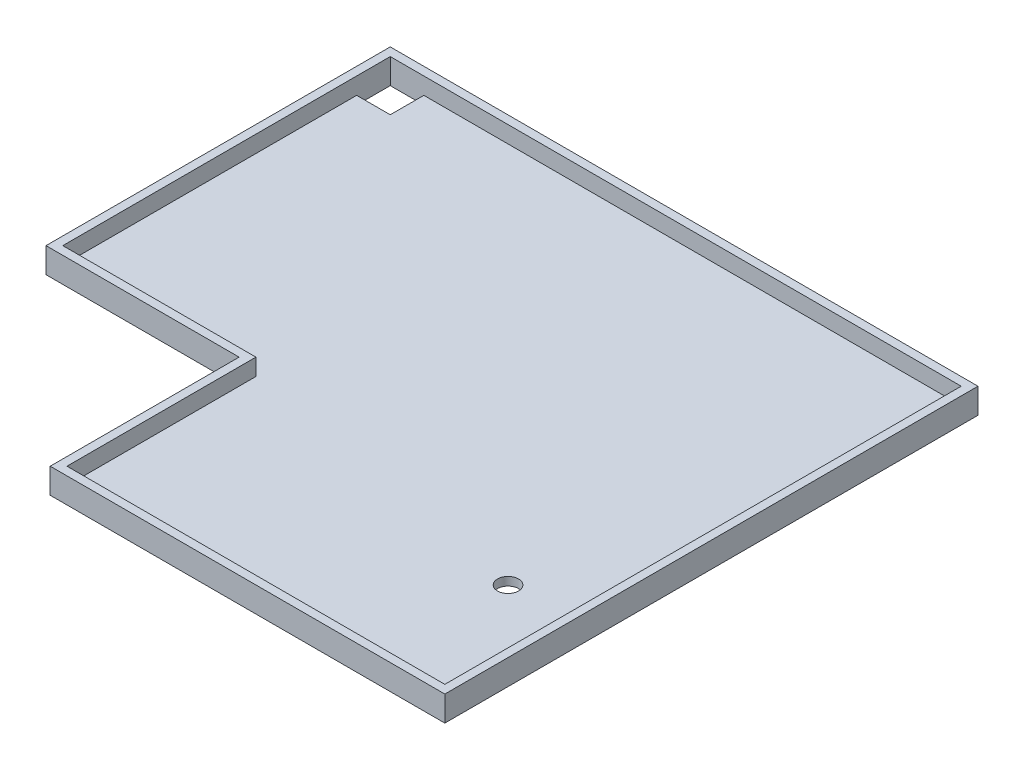
ISO-10303-21;
HEADER;
FILE_DESCRIPTION(('STEP AP214'),'2;1');
FILE_NAME('part.step','',(''),(''),'','','');
FILE_SCHEMA(('AUTOMOTIVE_DESIGN { 1 0 10303 214 1 1 1 1 }'));
ENDSEC;
DATA;
#1=APPLICATION_CONTEXT('core data for automotive mechanical design processes');
#2=APPLICATION_PROTOCOL_DEFINITION('international standard','automotive_design',2000,#1);
#3=PRODUCT_CONTEXT('',#1,'mechanical');
#4=PRODUCT('Part','Part','',(#3));
#5=PRODUCT_RELATED_PRODUCT_CATEGORY('part','',(#4));
#6=PRODUCT_DEFINITION_FORMATION('','',#4);
#7=PRODUCT_DEFINITION_CONTEXT('part definition',#1,'design');
#8=PRODUCT_DEFINITION('design','',#6,#7);
#9=PRODUCT_DEFINITION_SHAPE('','',#8);
#10=(LENGTH_UNIT() NAMED_UNIT(*) SI_UNIT(.MILLI.,.METRE.));
#11=(NAMED_UNIT(*) PLANE_ANGLE_UNIT() SI_UNIT($,.RADIAN.));
#12=(NAMED_UNIT(*) SI_UNIT($,.STERADIAN.) SOLID_ANGLE_UNIT());
#13=UNCERTAINTY_MEASURE_WITH_UNIT(LENGTH_MEASURE(1.E-05),#10,'distance_accuracy_value','');
#14=(GEOMETRIC_REPRESENTATION_CONTEXT(3) GLOBAL_UNCERTAINTY_ASSIGNED_CONTEXT((#13)) GLOBAL_UNIT_ASSIGNED_CONTEXT((#10,
#11,#12)) REPRESENTATION_CONTEXT('',''));
#15=CARTESIAN_POINT('',(0.,0.,0.));
#16=DIRECTION('',(0.,0.,1.));
#17=DIRECTION('',(1.,0.,0.));
#18=AXIS2_PLACEMENT_3D('',#15,#16,#17);
#19=CARTESIAN_POINT('',(35.,3.,0.));
#20=DIRECTION('',(1.,0.,0.));
#21=DIRECTION('',(0.,0.,-1.));
#22=AXIS2_PLACEMENT_3D('',#19,#20,#21);
#23=PLANE('',#22);
#24=DIRECTION('',(0.,0.,1.));
#25=VECTOR('',#24,1.);
#26=CARTESIAN_POINT('',(35.,0.,0.));
#27=LINE('',#26,#25);
#28=CARTESIAN_POINT('',(35.,0.,-20.));
#29=VERTEX_POINT('',#28);
#30=CARTESIAN_POINT('',(35.,0.,43.5));
#31=VERTEX_POINT('',#30);
#32=EDGE_CURVE('E225',#29,#31,#27,.T.);
#33=ORIENTED_EDGE('',*,*,#32,.F.);
#34=DIRECTION('',(0.,-1.,0.));
#35=VECTOR('',#34,1.);
#36=CARTESIAN_POINT('',(35.,3.,-20.));
#37=LINE('',#36,#35);
#38=CARTESIAN_POINT('',(35.,3.,-20.));
#39=VERTEX_POINT('',#38);
#40=EDGE_CURVE('E11',#39,#29,#37,.T.);
#41=ORIENTED_EDGE('',*,*,#40,.F.);
#42=DIRECTION('',(0.,0.,1.));
#43=VECTOR('',#42,1.);
#44=CARTESIAN_POINT('',(35.,3.,0.));
#45=LINE('',#44,#43);
#46=CARTESIAN_POINT('',(35.,3.,43.5));
#47=VERTEX_POINT('',#46);
#48=EDGE_CURVE('E226',#39,#47,#45,.T.);
#49=ORIENTED_EDGE('',*,*,#48,.T.);
#50=DIRECTION('',(0.,-1.,0.));
#51=VECTOR('',#50,1.);
#52=CARTESIAN_POINT('',(35.,3.,43.5));
#53=LINE('',#52,#51);
#54=EDGE_CURVE('E244',#47,#31,#53,.T.);
#55=ORIENTED_EDGE('',*,*,#54,.T.);
#56=EDGE_LOOP('',(#33,#41,#49,#55));
#57=FACE_BOUND('',#56,.T.);
#58=ADVANCED_FACE('F39',(#57),#23,.T.);
#59=CARTESIAN_POINT('',(0.,3.,-20.));
#60=DIRECTION('',(0.,0.,-1.));
#61=DIRECTION('',(-1.,0.,0.));
#62=AXIS2_PLACEMENT_3D('',#59,#60,#61);
#63=PLANE('',#62);
#64=DIRECTION('',(1.,0.,0.));
#65=VECTOR('',#64,1.);
#66=CARTESIAN_POINT('',(0.,0.,-20.));
#67=LINE('',#66,#65);
#68=CARTESIAN_POINT('',(-35.,0.,-20.));
#69=VERTEX_POINT('',#68);
#70=EDGE_CURVE('E247',#69,#29,#67,.T.);
#71=ORIENTED_EDGE('',*,*,#70,.F.);
#72=DIRECTION('',(0.,-1.,0.));
#73=VECTOR('',#72,1.);
#74=CARTESIAN_POINT('',(-35.,3.,-20.));
#75=LINE('',#74,#73);
#76=CARTESIAN_POINT('',(-35.,3.,-20.));
#77=VERTEX_POINT('',#76);
#78=EDGE_CURVE('E46',#77,#69,#75,.T.);
#79=ORIENTED_EDGE('',*,*,#78,.F.);
#80=DIRECTION('',(1.,0.,0.));
#81=VECTOR('',#80,1.);
#82=CARTESIAN_POINT('',(0.,3.,-20.));
#83=LINE('',#82,#81);
#84=EDGE_CURVE('E229',#77,#39,#83,.T.);
#85=ORIENTED_EDGE('',*,*,#84,.T.);
#86=ORIENTED_EDGE('',*,*,#40,.T.);
#87=EDGE_LOOP('',(#71,#79,#85,#86));
#88=FACE_BOUND('',#87,.T.);
#89=ADVANCED_FACE('F274',(#88),#63,.T.);
#90=CARTESIAN_POINT('',(-35.,3.,0.));
#91=DIRECTION('',(-1.,0.,0.));
#92=DIRECTION('',(0.,0.,1.));
#93=AXIS2_PLACEMENT_3D('',#90,#91,#92);
#94=PLANE('',#93);
#95=DIRECTION('',(0.,0.,-1.));
#96=VECTOR('',#95,1.);
#97=CARTESIAN_POINT('',(-35.,0.,0.));
#98=LINE('',#97,#96);
#99=CARTESIAN_POINT('',(-35.,0.,21.));
#100=VERTEX_POINT('',#99);
#101=EDGE_CURVE('E250',#100,#69,#98,.T.);
#102=ORIENTED_EDGE('',*,*,#101,.F.);
#103=DIRECTION('',(0.,-1.,0.));
#104=VECTOR('',#103,1.);
#105=CARTESIAN_POINT('',(-35.,3.,21.));
#106=LINE('',#105,#104);
#107=CARTESIAN_POINT('',(-35.,3.,21.));
#108=VERTEX_POINT('',#107);
#109=EDGE_CURVE('E266',#108,#100,#106,.T.);
#110=ORIENTED_EDGE('',*,*,#109,.F.);
#111=DIRECTION('',(0.,0.,-1.));
#112=VECTOR('',#111,1.);
#113=CARTESIAN_POINT('',(-35.,3.,0.));
#114=LINE('',#113,#112);
#115=EDGE_CURVE('E233',#108,#77,#114,.T.);
#116=ORIENTED_EDGE('',*,*,#115,.T.);
#117=ORIENTED_EDGE('',*,*,#78,.T.);
#118=EDGE_LOOP('',(#102,#110,#116,#117));
#119=FACE_BOUND('',#118,.T.);
#120=ADVANCED_FACE('F270',(#119),#94,.T.);
#121=CARTESIAN_POINT('',(0.,3.,21.));
#122=DIRECTION('',(0.,0.,1.));
#123=DIRECTION('',(1.,0.,0.));
#124=AXIS2_PLACEMENT_3D('',#121,#122,#123);
#125=PLANE('',#124);
#126=DIRECTION('',(-1.,0.,0.));
#127=VECTOR('',#126,1.);
#128=CARTESIAN_POINT('',(0.,0.,21.));
#129=LINE('',#128,#127);
#130=CARTESIAN_POINT('',(-12.,0.,21.));
#131=VERTEX_POINT('',#130);
#132=EDGE_CURVE('E253',#131,#100,#129,.T.);
#133=ORIENTED_EDGE('',*,*,#132,.F.);
#134=DIRECTION('',(0.,-1.,0.));
#135=VECTOR('',#134,1.);
#136=CARTESIAN_POINT('',(-12.,3.,21.));
#137=LINE('',#136,#135);
#138=CARTESIAN_POINT('',(-12.,3.,21.));
#139=VERTEX_POINT('',#138);
#140=EDGE_CURVE('E264',#139,#131,#137,.T.);
#141=ORIENTED_EDGE('',*,*,#140,.F.);
#142=DIRECTION('',(-1.,0.,0.));
#143=VECTOR('',#142,1.);
#144=CARTESIAN_POINT('',(0.,3.,21.));
#145=LINE('',#144,#143);
#146=EDGE_CURVE('E236',#139,#108,#145,.T.);
#147=ORIENTED_EDGE('',*,*,#146,.T.);
#148=ORIENTED_EDGE('',*,*,#109,.T.);
#149=EDGE_LOOP('',(#133,#141,#147,#148));
#150=FACE_BOUND('',#149,.T.);
#151=ADVANCED_FACE('F281',(#150),#125,.T.);
#152=CARTESIAN_POINT('',(-12.,3.,0.));
#153=DIRECTION('',(-1.,0.,0.));
#154=DIRECTION('',(0.,0.,1.));
#155=AXIS2_PLACEMENT_3D('',#152,#153,#154);
#156=PLANE('',#155);
#157=DIRECTION('',(0.,0.,-1.));
#158=VECTOR('',#157,1.);
#159=CARTESIAN_POINT('',(-12.,0.,0.));
#160=LINE('',#159,#158);
#161=CARTESIAN_POINT('',(-12.,0.,43.5));
#162=VERTEX_POINT('',#161);
#163=EDGE_CURVE('E256',#162,#131,#160,.T.);
#164=ORIENTED_EDGE('',*,*,#163,.F.);
#165=DIRECTION('',(0.,-1.,0.));
#166=VECTOR('',#165,1.);
#167=CARTESIAN_POINT('',(-12.,3.,43.5));
#168=LINE('',#167,#166);
#169=CARTESIAN_POINT('',(-12.,3.,43.5));
#170=VERTEX_POINT('',#169);
#171=EDGE_CURVE('E262',#170,#162,#168,.T.);
#172=ORIENTED_EDGE('',*,*,#171,.F.);
#173=DIRECTION('',(0.,0.,-1.));
#174=VECTOR('',#173,1.);
#175=CARTESIAN_POINT('',(-12.,3.,0.));
#176=LINE('',#175,#174);
#177=EDGE_CURVE('E239',#170,#139,#176,.T.);
#178=ORIENTED_EDGE('',*,*,#177,.T.);
#179=ORIENTED_EDGE('',*,*,#140,.T.);
#180=EDGE_LOOP('',(#164,#172,#178,#179));
#181=FACE_BOUND('',#180,.T.);
#182=ADVANCED_FACE('F292',(#181),#156,.T.);
#183=CARTESIAN_POINT('',(0.,3.,43.5));
#184=DIRECTION('',(0.,0.,-1.));
#185=DIRECTION('',(-1.,0.,0.));
#186=AXIS2_PLACEMENT_3D('',#183,#184,#185);
#187=PLANE('',#186);
#188=DIRECTION('',(1.,0.,0.));
#189=VECTOR('',#188,1.);
#190=CARTESIAN_POINT('',(0.,0.,43.5));
#191=LINE('',#190,#189);
#192=EDGE_CURVE('E230',#162,#31,#191,.T.);
#193=ORIENTED_EDGE('',*,*,#192,.T.);
#194=ORIENTED_EDGE('',*,*,#54,.F.);
#195=DIRECTION('',(1.,0.,0.));
#196=VECTOR('',#195,1.);
#197=CARTESIAN_POINT('',(0.,3.,43.5));
#198=LINE('',#197,#196);
#199=EDGE_CURVE('E242',#170,#47,#198,.T.);
#200=ORIENTED_EDGE('',*,*,#199,.F.);
#201=ORIENTED_EDGE('',*,*,#171,.T.);
#202=EDGE_LOOP('',(#193,#194,#200,#201));
#203=FACE_BOUND('',#202,.T.);
#204=ADVANCED_FACE('F293',(#203),#187,.F.);
#205=CARTESIAN_POINT('',(0.,3.,0.));
#206=DIRECTION('',(0.,1.,0.));
#207=DIRECTION('',(0.,0.,1.));
#208=AXIS2_PLACEMENT_3D('',#205,#206,#207);
#209=PLANE('',#208);
#210=DIRECTION('',(0.,0.,1.));
#211=VECTOR('',#210,1.);
#212=CARTESIAN_POINT('',(34.,3.,0.));
#213=LINE('',#212,#211);
#214=CARTESIAN_POINT('',(34.,3.,-19.));
#215=VERTEX_POINT('',#214);
#216=CARTESIAN_POINT('',(34.,3.,42.5));
#217=VERTEX_POINT('',#216);
#218=EDGE_CURVE('E181',#215,#217,#213,.T.);
#219=ORIENTED_EDGE('',*,*,#218,.T.);
#220=DIRECTION('',(1.,0.,0.));
#221=VECTOR('',#220,1.);
#222=CARTESIAN_POINT('',(0.,3.,42.5));
#223=LINE('',#222,#221);
#224=CARTESIAN_POINT('',(-11.,3.,42.5));
#225=VERTEX_POINT('',#224);
#226=EDGE_CURVE('E197',#225,#217,#223,.T.);
#227=ORIENTED_EDGE('',*,*,#226,.F.);
#228=DIRECTION('',(0.,0.,-1.));
#229=VECTOR('',#228,1.);
#230=CARTESIAN_POINT('',(-11.,3.,0.));
#231=LINE('',#230,#229);
#232=CARTESIAN_POINT('',(-11.,3.,20.));
#233=VERTEX_POINT('',#232);
#234=EDGE_CURVE('E194',#225,#233,#231,.T.);
#235=ORIENTED_EDGE('',*,*,#234,.T.);
#236=DIRECTION('',(-1.,0.,0.));
#237=VECTOR('',#236,1.);
#238=CARTESIAN_POINT('',(0.,3.,20.));
#239=LINE('',#238,#237);
#240=CARTESIAN_POINT('',(-34.,3.,20.));
#241=VERTEX_POINT('',#240);
#242=EDGE_CURVE('E191',#233,#241,#239,.T.);
#243=ORIENTED_EDGE('',*,*,#242,.T.);
#244=DIRECTION('',(0.,0.,-1.));
#245=VECTOR('',#244,1.);
#246=CARTESIAN_POINT('',(-34.,3.,0.));
#247=LINE('',#246,#245);
#248=CARTESIAN_POINT('',(-34.,3.,-19.));
#249=VERTEX_POINT('',#248);
#250=EDGE_CURVE('E188',#241,#249,#247,.T.);
#251=ORIENTED_EDGE('',*,*,#250,.T.);
#252=DIRECTION('',(1.,0.,0.));
#253=VECTOR('',#252,1.);
#254=CARTESIAN_POINT('',(0.,3.,-19.));
#255=LINE('',#254,#253);
#256=EDGE_CURVE('E184',#249,#215,#255,.T.);
#257=ORIENTED_EDGE('',*,*,#256,.T.);
#258=EDGE_LOOP('',(#219,#227,#235,#243,#251,#257));
#259=FACE_BOUND('',#258,.T.);
#260=ORIENTED_EDGE('',*,*,#48,.F.);
#261=ORIENTED_EDGE('',*,*,#84,.F.);
#262=ORIENTED_EDGE('',*,*,#115,.F.);
#263=ORIENTED_EDGE('',*,*,#146,.F.);
#264=ORIENTED_EDGE('',*,*,#177,.F.);
#265=ORIENTED_EDGE('',*,*,#199,.T.);
#266=EDGE_LOOP('',(#260,#261,#262,#263,#264,#265));
#267=FACE_BOUND('',#266,.T.);
#268=ADVANCED_FACE('F285',(#259,#267),#209,.T.);
#269=CARTESIAN_POINT('',(0.,0.,0.));
#270=DIRECTION('',(0.,1.,0.));
#271=DIRECTION('',(0.,0.,1.));
#272=AXIS2_PLACEMENT_3D('',#269,#270,#271);
#273=PLANE('',#272);
#274=DIRECTION('',(1.,0.,0.));
#275=VECTOR('',#274,1.);
#276=CARTESIAN_POINT('',(-34.,0.,-19.));
#277=LINE('',#276,#275);
#278=CARTESIAN_POINT('',(-34.,0.,-19.));
#279=VERTEX_POINT('',#278);
#280=CARTESIAN_POINT('',(-30.,0.,-19.));
#281=VERTEX_POINT('',#280);
#282=EDGE_CURVE('E164',#279,#281,#277,.T.);
#283=ORIENTED_EDGE('',*,*,#282,.F.);
#284=DIRECTION('',(0.,0.,-1.));
#285=VECTOR('',#284,1.);
#286=CARTESIAN_POINT('',(-34.,0.,-19.));
#287=LINE('',#286,#285);
#288=CARTESIAN_POINT('',(-34.,0.,-15.));
#289=VERTEX_POINT('',#288);
#290=EDGE_CURVE('E147',#289,#279,#287,.T.);
#291=ORIENTED_EDGE('',*,*,#290,.F.);
#292=DIRECTION('',(-1.,0.,0.));
#293=VECTOR('',#292,1.);
#294=CARTESIAN_POINT('',(-34.,0.,-15.));
#295=LINE('',#294,#293);
#296=CARTESIAN_POINT('',(-30.,0.,-15.));
#297=VERTEX_POINT('',#296);
#298=EDGE_CURVE('E155',#297,#289,#295,.T.);
#299=ORIENTED_EDGE('',*,*,#298,.F.);
#300=DIRECTION('',(0.,0.,1.));
#301=VECTOR('',#300,1.);
#302=CARTESIAN_POINT('',(-30.,0.,-19.));
#303=LINE('',#302,#301);
#304=EDGE_CURVE('E53',#281,#297,#303,.T.);
#305=ORIENTED_EDGE('',*,*,#304,.F.);
#306=EDGE_LOOP('',(#283,#291,#299,#305));
#307=FACE_BOUND('',#306,.T.);
#308=CARTESIAN_POINT('',(25.5140703453169,0.,26.4861130733692));
#309=DIRECTION('',(0.,1.,0.));
#310=DIRECTION('',(0.,0.,1.));
#311=AXIS2_PLACEMENT_3D('',#308,#309,#310);
#312=CIRCLE('',#311,1.25);
#313=CARTESIAN_POINT('',(25.5140703453169,0.,27.7361130733692));
#314=VERTEX_POINT('',#313);
#315=EDGE_CURVE('E175',#314,#314,#312,.T.);
#316=ORIENTED_EDGE('',*,*,#315,.T.);
#317=EDGE_LOOP('',(#316));
#318=FACE_BOUND('',#317,.T.);
#319=ORIENTED_EDGE('',*,*,#32,.T.);
#320=ORIENTED_EDGE('',*,*,#192,.F.);
#321=ORIENTED_EDGE('',*,*,#163,.T.);
#322=ORIENTED_EDGE('',*,*,#132,.T.);
#323=ORIENTED_EDGE('',*,*,#101,.T.);
#324=ORIENTED_EDGE('',*,*,#70,.T.);
#325=EDGE_LOOP('',(#319,#320,#321,#322,#323,#324));
#326=FACE_BOUND('',#325,.T.);
#327=ADVANCED_FACE('F161',(#307,#318,#326),#273,.F.);
#328=CARTESIAN_POINT('',(34.,3.,0.));
#329=DIRECTION('',(1.,0.,0.));
#330=DIRECTION('',(0.,0.,-1.));
#331=AXIS2_PLACEMENT_3D('',#328,#329,#330);
#332=PLANE('',#331);
#333=DIRECTION('',(0.,0.,1.));
#334=VECTOR('',#333,1.);
#335=CARTESIAN_POINT('',(34.,1.,0.));
#336=LINE('',#335,#334);
#337=CARTESIAN_POINT('',(34.,1.,-19.));
#338=VERTEX_POINT('',#337);
#339=CARTESIAN_POINT('',(34.,1.,42.5));
#340=VERTEX_POINT('',#339);
#341=EDGE_CURVE('E178',#338,#340,#336,.T.);
#342=ORIENTED_EDGE('',*,*,#341,.T.);
#343=DIRECTION('',(0.,-1.,0.));
#344=VECTOR('',#343,1.);
#345=CARTESIAN_POINT('',(34.,3.,42.5));
#346=LINE('',#345,#344);
#347=EDGE_CURVE('E199',#217,#340,#346,.T.);
#348=ORIENTED_EDGE('',*,*,#347,.F.);
#349=ORIENTED_EDGE('',*,*,#218,.F.);
#350=DIRECTION('',(0.,-1.,0.));
#351=VECTOR('',#350,1.);
#352=CARTESIAN_POINT('',(34.,3.,-19.));
#353=LINE('',#352,#351);
#354=EDGE_CURVE('E222',#215,#338,#353,.T.);
#355=ORIENTED_EDGE('',*,*,#354,.T.);
#356=EDGE_LOOP('',(#342,#348,#349,#355));
#357=FACE_BOUND('',#356,.T.);
#358=ADVANCED_FACE('F339',(#357),#332,.F.);
#359=CARTESIAN_POINT('',(0.,3.,-19.));
#360=DIRECTION('',(0.,0.,-1.));
#361=DIRECTION('',(-1.,0.,0.));
#362=AXIS2_PLACEMENT_3D('',#359,#360,#361);
#363=PLANE('',#362);
#364=DIRECTION('',(0.,-1.,0.));
#365=VECTOR('',#364,1.);
#366=CARTESIAN_POINT('',(-34.,3.,-19.));
#367=LINE('',#366,#365);
#368=EDGE_CURVE('E220',#249,#279,#367,.T.);
#369=ORIENTED_EDGE('',*,*,#368,.T.);
#370=ORIENTED_EDGE('',*,*,#282,.T.);
#371=DIRECTION('',(0.,1.,0.));
#372=VECTOR('',#371,1.);
#373=CARTESIAN_POINT('',(-30.,-0.000999999999999916,-19.));
#374=LINE('',#373,#372);
#375=CARTESIAN_POINT('',(-30.,1.,-19.));
#376=VERTEX_POINT('',#375);
#377=EDGE_CURVE('E159',#281,#376,#374,.T.);
#378=ORIENTED_EDGE('',*,*,#377,.T.);
#379=DIRECTION('',(1.,0.,0.));
#380=VECTOR('',#379,1.);
#381=CARTESIAN_POINT('',(0.,1.,-19.));
#382=LINE('',#381,#380);
#383=EDGE_CURVE('E202',#376,#338,#382,.T.);
#384=ORIENTED_EDGE('',*,*,#383,.T.);
#385=ORIENTED_EDGE('',*,*,#354,.F.);
#386=ORIENTED_EDGE('',*,*,#256,.F.);
#387=EDGE_LOOP('',(#369,#370,#378,#384,#385,#386));
#388=FACE_BOUND('',#387,.T.);
#389=ADVANCED_FACE('F344',(#388),#363,.F.);
#390=CARTESIAN_POINT('',(-34.,3.,0.));
#391=DIRECTION('',(-1.,0.,0.));
#392=DIRECTION('',(0.,0.,1.));
#393=AXIS2_PLACEMENT_3D('',#390,#391,#392);
#394=PLANE('',#393);
#395=DIRECTION('',(0.,0.,-1.));
#396=VECTOR('',#395,1.);
#397=CARTESIAN_POINT('',(-34.,1.,0.));
#398=LINE('',#397,#396);
#399=CARTESIAN_POINT('',(-34.,1.,20.));
#400=VERTEX_POINT('',#399);
#401=CARTESIAN_POINT('',(-34.,1.,-15.));
#402=VERTEX_POINT('',#401);
#403=EDGE_CURVE('E150',#400,#402,#398,.T.);
#404=ORIENTED_EDGE('',*,*,#403,.T.);
#405=DIRECTION('',(0.,1.,0.));
#406=VECTOR('',#405,1.);
#407=CARTESIAN_POINT('',(-34.,-0.000999999999999916,-15.));
#408=LINE('',#407,#406);
#409=EDGE_CURVE('E61',#289,#402,#408,.T.);
#410=ORIENTED_EDGE('',*,*,#409,.F.);
#411=ORIENTED_EDGE('',*,*,#290,.T.);
#412=ORIENTED_EDGE('',*,*,#368,.F.);
#413=ORIENTED_EDGE('',*,*,#250,.F.);
#414=DIRECTION('',(0.,-1.,0.));
#415=VECTOR('',#414,1.);
#416=CARTESIAN_POINT('',(-34.,3.,20.));
#417=LINE('',#416,#415);
#418=EDGE_CURVE('E218',#241,#400,#417,.T.);
#419=ORIENTED_EDGE('',*,*,#418,.T.);
#420=EDGE_LOOP('',(#404,#410,#411,#412,#413,#419));
#421=FACE_BOUND('',#420,.T.);
#422=ADVANCED_FACE('F145',(#421),#394,.F.);
#423=CARTESIAN_POINT('',(0.,3.,20.));
#424=DIRECTION('',(0.,0.,1.));
#425=DIRECTION('',(1.,0.,0.));
#426=AXIS2_PLACEMENT_3D('',#423,#424,#425);
#427=PLANE('',#426);
#428=DIRECTION('',(-1.,0.,0.));
#429=VECTOR('',#428,1.);
#430=CARTESIAN_POINT('',(0.,1.,20.));
#431=LINE('',#430,#429);
#432=CARTESIAN_POINT('',(-11.,1.,20.));
#433=VERTEX_POINT('',#432);
#434=EDGE_CURVE('E205',#433,#400,#431,.T.);
#435=ORIENTED_EDGE('',*,*,#434,.T.);
#436=ORIENTED_EDGE('',*,*,#418,.F.);
#437=ORIENTED_EDGE('',*,*,#242,.F.);
#438=DIRECTION('',(0.,-1.,0.));
#439=VECTOR('',#438,1.);
#440=CARTESIAN_POINT('',(-11.,3.,20.));
#441=LINE('',#440,#439);
#442=EDGE_CURVE('E216',#233,#433,#441,.T.);
#443=ORIENTED_EDGE('',*,*,#442,.T.);
#444=EDGE_LOOP('',(#435,#436,#437,#443));
#445=FACE_BOUND('',#444,.T.);
#446=ADVANCED_FACE('F353',(#445),#427,.F.);
#447=CARTESIAN_POINT('',(-11.,3.,0.));
#448=DIRECTION('',(-1.,0.,0.));
#449=DIRECTION('',(0.,0.,1.));
#450=AXIS2_PLACEMENT_3D('',#447,#448,#449);
#451=PLANE('',#450);
#452=DIRECTION('',(0.,0.,-1.));
#453=VECTOR('',#452,1.);
#454=CARTESIAN_POINT('',(-11.,1.,0.));
#455=LINE('',#454,#453);
#456=CARTESIAN_POINT('',(-11.,1.,42.5));
#457=VERTEX_POINT('',#456);
#458=EDGE_CURVE('E208',#457,#433,#455,.T.);
#459=ORIENTED_EDGE('',*,*,#458,.T.);
#460=ORIENTED_EDGE('',*,*,#442,.F.);
#461=ORIENTED_EDGE('',*,*,#234,.F.);
#462=DIRECTION('',(0.,-1.,0.));
#463=VECTOR('',#462,1.);
#464=CARTESIAN_POINT('',(-11.,3.,42.5));
#465=LINE('',#464,#463);
#466=EDGE_CURVE('E214',#225,#457,#465,.T.);
#467=ORIENTED_EDGE('',*,*,#466,.T.);
#468=EDGE_LOOP('',(#459,#460,#461,#467));
#469=FACE_BOUND('',#468,.T.);
#470=ADVANCED_FACE('F357',(#469),#451,.F.);
#471=CARTESIAN_POINT('',(0.,3.,42.5));
#472=DIRECTION('',(0.,0.,-1.));
#473=DIRECTION('',(-1.,0.,0.));
#474=AXIS2_PLACEMENT_3D('',#471,#472,#473);
#475=PLANE('',#474);
#476=DIRECTION('',(1.,0.,0.));
#477=VECTOR('',#476,1.);
#478=CARTESIAN_POINT('',(0.,1.,42.5));
#479=LINE('',#478,#477);
#480=EDGE_CURVE('E185',#457,#340,#479,.T.);
#481=ORIENTED_EDGE('',*,*,#480,.F.);
#482=ORIENTED_EDGE('',*,*,#466,.F.);
#483=ORIENTED_EDGE('',*,*,#226,.T.);
#484=ORIENTED_EDGE('',*,*,#347,.T.);
#485=EDGE_LOOP('',(#481,#482,#483,#484));
#486=FACE_BOUND('',#485,.T.);
#487=ADVANCED_FACE('F368',(#486),#475,.T.);
#488=CARTESIAN_POINT('',(0.,1.,0.));
#489=DIRECTION('',(0.,1.,0.));
#490=DIRECTION('',(0.,0.,1.));
#491=AXIS2_PLACEMENT_3D('',#488,#489,#490);
#492=PLANE('',#491);
#493=DIRECTION('',(0.,0.,-1.));
#494=VECTOR('',#493,1.);
#495=CARTESIAN_POINT('',(-30.,1.,-19.));
#496=LINE('',#495,#494);
#497=CARTESIAN_POINT('',(-30.,1.,-15.));
#498=VERTEX_POINT('',#497);
#499=EDGE_CURVE('E152',#498,#376,#496,.T.);
#500=ORIENTED_EDGE('',*,*,#499,.F.);
#501=DIRECTION('',(1.,0.,0.));
#502=VECTOR('',#501,1.);
#503=CARTESIAN_POINT('',(-34.,1.,-15.));
#504=LINE('',#503,#502);
#505=EDGE_CURVE('E165',#402,#498,#504,.T.);
#506=ORIENTED_EDGE('',*,*,#505,.F.);
#507=ORIENTED_EDGE('',*,*,#403,.F.);
#508=ORIENTED_EDGE('',*,*,#434,.F.);
#509=ORIENTED_EDGE('',*,*,#458,.F.);
#510=ORIENTED_EDGE('',*,*,#480,.T.);
#511=ORIENTED_EDGE('',*,*,#341,.F.);
#512=ORIENTED_EDGE('',*,*,#383,.F.);
#513=EDGE_LOOP('',(#500,#506,#507,#508,#509,#510,#511,#512));
#514=FACE_BOUND('',#513,.T.);
#515=CARTESIAN_POINT('',(25.5140703453169,1.,26.4861130733692));
#516=DIRECTION('',(0.,1.,0.));
#517=DIRECTION('',(0.,0.,1.));
#518=AXIS2_PLACEMENT_3D('',#515,#516,#517);
#519=CIRCLE('',#518,1.25);
#520=CARTESIAN_POINT('',(25.5140703453169,1.,27.7361130733692));
#521=VERTEX_POINT('',#520);
#522=EDGE_CURVE('E158',#521,#521,#519,.T.);
#523=ORIENTED_EDGE('',*,*,#522,.F.);
#524=EDGE_LOOP('',(#523));
#525=FACE_BOUND('',#524,.T.);
#526=ADVANCED_FACE('F378',(#514,#525),#492,.T.);
#527=CARTESIAN_POINT('',(25.5140703453169,0.,26.4861130733692));
#528=DIRECTION('',(0.,1.,0.));
#529=DIRECTION('',(0.,0.,1.));
#530=AXIS2_PLACEMENT_3D('',#527,#528,#529);
#531=CYLINDRICAL_SURFACE('',#530,1.25);
#532=ORIENTED_EDGE('',*,*,#315,.F.);
#533=EDGE_LOOP('',(#532));
#534=FACE_BOUND('',#533,.T.);
#535=ORIENTED_EDGE('',*,*,#522,.T.);
#536=EDGE_LOOP('',(#535));
#537=FACE_BOUND('',#536,.T.);
#538=ADVANCED_FACE('F386',(#534,#537),#531,.F.);
#539=CARTESIAN_POINT('',(-30.,-0.000999999999999916,-19.));
#540=DIRECTION('',(1.,0.,0.));
#541=DIRECTION('',(0.,0.,-1.));
#542=AXIS2_PLACEMENT_3D('',#539,#540,#541);
#543=PLANE('',#542);
#544=ORIENTED_EDGE('',*,*,#304,.T.);
#545=DIRECTION('',(0.,1.,0.));
#546=VECTOR('',#545,1.);
#547=CARTESIAN_POINT('',(-30.,-0.000999999999999916,-15.));
#548=LINE('',#547,#546);
#549=EDGE_CURVE('E151',#297,#498,#548,.T.);
#550=ORIENTED_EDGE('',*,*,#549,.T.);
#551=ORIENTED_EDGE('',*,*,#499,.T.);
#552=ORIENTED_EDGE('',*,*,#377,.F.);
#553=EDGE_LOOP('',(#544,#550,#551,#552));
#554=FACE_BOUND('',#553,.T.);
#555=ADVANCED_FACE('F391',(#554),#543,.F.);
#556=CARTESIAN_POINT('',(-34.,-0.000999999999999916,-15.));
#557=DIRECTION('',(0.,0.,1.));
#558=DIRECTION('',(1.,0.,0.));
#559=AXIS2_PLACEMENT_3D('',#556,#557,#558);
#560=PLANE('',#559);
#561=ORIENTED_EDGE('',*,*,#298,.T.);
#562=ORIENTED_EDGE('',*,*,#409,.T.);
#563=ORIENTED_EDGE('',*,*,#505,.T.);
#564=ORIENTED_EDGE('',*,*,#549,.F.);
#565=EDGE_LOOP('',(#561,#562,#563,#564));
#566=FACE_BOUND('',#565,.T.);
#567=ADVANCED_FACE('F156',(#566),#560,.F.);
#568=CLOSED_SHELL('',(#58,#89,#120,#151,#182,#204,#268,#327,#358,#389,#422,#446,#470,#487,#526,
#538,#555,#567));
#569=MANIFOLD_SOLID_BREP('B2',#568);
#570=ADVANCED_BREP_SHAPE_REPRESENTATION('',(#18,#569),#14);
#571=SHAPE_DEFINITION_REPRESENTATION(#9,#570);
ENDSEC;
END-ISO-10303-21;
